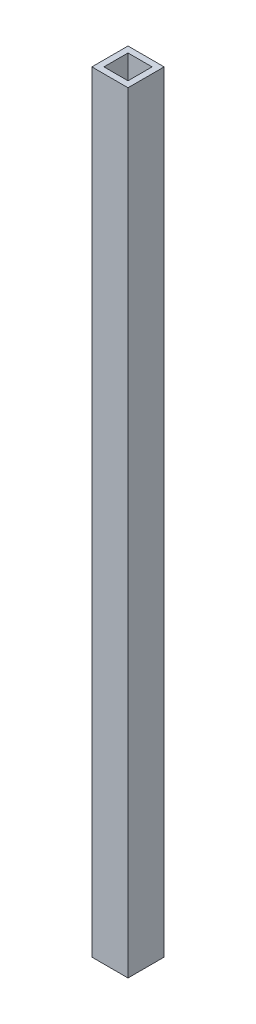
ISO-10303-21;
HEADER;
FILE_DESCRIPTION(('STEP AP214'),'2;1');
FILE_NAME('part.step','',(''),(''),'','','');
FILE_SCHEMA(('AUTOMOTIVE_DESIGN { 1 0 10303 214 1 1 1 1 }'));
ENDSEC;
DATA;
#1=APPLICATION_CONTEXT('core data for automotive mechanical design processes');
#2=APPLICATION_PROTOCOL_DEFINITION('international standard','automotive_design',2000,#1);
#3=PRODUCT_CONTEXT('',#1,'mechanical');
#4=PRODUCT('Part','Part','',(#3));
#5=PRODUCT_RELATED_PRODUCT_CATEGORY('part','',(#4));
#6=PRODUCT_DEFINITION_FORMATION('','',#4);
#7=PRODUCT_DEFINITION_CONTEXT('part definition',#1,'design');
#8=PRODUCT_DEFINITION('design','',#6,#7);
#9=PRODUCT_DEFINITION_SHAPE('','',#8);
#10=(LENGTH_UNIT() NAMED_UNIT(*) SI_UNIT(.MILLI.,.METRE.));
#11=(NAMED_UNIT(*) PLANE_ANGLE_UNIT() SI_UNIT($,.RADIAN.));
#12=(NAMED_UNIT(*) SI_UNIT($,.STERADIAN.) SOLID_ANGLE_UNIT());
#13=UNCERTAINTY_MEASURE_WITH_UNIT(LENGTH_MEASURE(1.E-05),#10,'distance_accuracy_value','');
#14=(GEOMETRIC_REPRESENTATION_CONTEXT(3) GLOBAL_UNCERTAINTY_ASSIGNED_CONTEXT((#13)) GLOBAL_UNIT_ASSIGNED_CONTEXT((#10,
#11,#12)) REPRESENTATION_CONTEXT('',''));
#15=CARTESIAN_POINT('',(0.,0.,0.));
#16=DIRECTION('',(0.,0.,1.));
#17=DIRECTION('',(1.,0.,0.));
#18=AXIS2_PLACEMENT_3D('',#15,#16,#17);
#19=CARTESIAN_POINT('',(0.,406.4,0.));
#20=DIRECTION('',(1.,0.,0.));
#21=DIRECTION('',(0.,0.,-1.));
#22=AXIS2_PLACEMENT_3D('',#19,#20,#21);
#23=PLANE('',#22);
#24=DIRECTION('',(0.,0.,1.));
#25=VECTOR('',#24,1.);
#26=CARTESIAN_POINT('',(0.,0.,0.));
#27=LINE('',#26,#25);
#28=CARTESIAN_POINT('',(0.,0.,-19.05));
#29=VERTEX_POINT('',#28);
#30=CARTESIAN_POINT('',(0.,0.,0.));
#31=VERTEX_POINT('',#30);
#32=EDGE_CURVE('E130',#29,#31,#27,.T.);
#33=ORIENTED_EDGE('',*,*,#32,.T.);
#34=DIRECTION('',(0.,-1.,0.));
#35=VECTOR('',#34,1.);
#36=CARTESIAN_POINT('',(0.,406.4,0.));
#37=LINE('',#36,#35);
#38=CARTESIAN_POINT('',(0.,406.4,0.));
#39=VERTEX_POINT('',#38);
#40=EDGE_CURVE('E11',#39,#31,#37,.T.);
#41=ORIENTED_EDGE('',*,*,#40,.F.);
#42=DIRECTION('',(0.,0.,1.));
#43=VECTOR('',#42,1.);
#44=CARTESIAN_POINT('',(0.,406.4,0.));
#45=LINE('',#44,#43);
#46=CARTESIAN_POINT('',(0.,406.4,-19.05));
#47=VERTEX_POINT('',#46);
#48=EDGE_CURVE('E134',#47,#39,#45,.T.);
#49=ORIENTED_EDGE('',*,*,#48,.F.);
#50=DIRECTION('',(0.,-1.,0.));
#51=VECTOR('',#50,1.);
#52=CARTESIAN_POINT('',(0.,406.4,-19.05));
#53=LINE('',#52,#51);
#54=EDGE_CURVE('E144',#47,#29,#53,.T.);
#55=ORIENTED_EDGE('',*,*,#54,.T.);
#56=EDGE_LOOP('',(#33,#41,#49,#55));
#57=FACE_BOUND('',#56,.T.);
#58=ADVANCED_FACE('F33',(#57),#23,.F.);
#59=CARTESIAN_POINT('',(0.,406.4,0.));
#60=DIRECTION('',(0.,0.,-1.));
#61=DIRECTION('',(-1.,0.,0.));
#62=AXIS2_PLACEMENT_3D('',#59,#60,#61);
#63=PLANE('',#62);
#64=DIRECTION('',(1.,0.,0.));
#65=VECTOR('',#64,1.);
#66=CARTESIAN_POINT('',(0.,0.,0.));
#67=LINE('',#66,#65);
#68=CARTESIAN_POINT('',(19.05,0.,0.));
#69=VERTEX_POINT('',#68);
#70=EDGE_CURVE('E147',#31,#69,#67,.T.);
#71=ORIENTED_EDGE('',*,*,#70,.T.);
#72=DIRECTION('',(0.,-1.,0.));
#73=VECTOR('',#72,1.);
#74=CARTESIAN_POINT('',(19.05,406.4,0.));
#75=LINE('',#74,#73);
#76=CARTESIAN_POINT('',(19.05,406.4,0.));
#77=VERTEX_POINT('',#76);
#78=EDGE_CURVE('E40',#77,#69,#75,.T.);
#79=ORIENTED_EDGE('',*,*,#78,.F.);
#80=DIRECTION('',(1.,0.,0.));
#81=VECTOR('',#80,1.);
#82=CARTESIAN_POINT('',(0.,406.4,0.));
#83=LINE('',#82,#81);
#84=EDGE_CURVE('E137',#39,#77,#83,.T.);
#85=ORIENTED_EDGE('',*,*,#84,.F.);
#86=ORIENTED_EDGE('',*,*,#40,.T.);
#87=EDGE_LOOP('',(#71,#79,#85,#86));
#88=FACE_BOUND('',#87,.T.);
#89=ADVANCED_FACE('F175',(#88),#63,.F.);
#90=CARTESIAN_POINT('',(19.05,406.4,0.));
#91=DIRECTION('',(-1.,0.,0.));
#92=DIRECTION('',(0.,0.,1.));
#93=AXIS2_PLACEMENT_3D('',#90,#91,#92);
#94=PLANE('',#93);
#95=DIRECTION('',(0.,0.,-1.));
#96=VECTOR('',#95,1.);
#97=CARTESIAN_POINT('',(19.05,0.,0.));
#98=LINE('',#97,#96);
#99=CARTESIAN_POINT('',(19.05,0.,-19.05));
#100=VERTEX_POINT('',#99);
#101=EDGE_CURVE('E149',#69,#100,#98,.T.);
#102=ORIENTED_EDGE('',*,*,#101,.T.);
#103=DIRECTION('',(0.,-1.,0.));
#104=VECTOR('',#103,1.);
#105=CARTESIAN_POINT('',(19.05,406.4,-19.05));
#106=LINE('',#105,#104);
#107=CARTESIAN_POINT('',(19.05,406.4,-19.05));
#108=VERTEX_POINT('',#107);
#109=EDGE_CURVE('E154',#108,#100,#106,.T.);
#110=ORIENTED_EDGE('',*,*,#109,.F.);
#111=DIRECTION('',(0.,0.,-1.));
#112=VECTOR('',#111,1.);
#113=CARTESIAN_POINT('',(19.05,406.4,0.));
#114=LINE('',#113,#112);
#115=EDGE_CURVE('E140',#77,#108,#114,.T.);
#116=ORIENTED_EDGE('',*,*,#115,.F.);
#117=ORIENTED_EDGE('',*,*,#78,.T.);
#118=EDGE_LOOP('',(#102,#110,#116,#117));
#119=FACE_BOUND('',#118,.T.);
#120=ADVANCED_FACE('F161',(#119),#94,.F.);
#121=CARTESIAN_POINT('',(0.,406.4,-19.05));
#122=DIRECTION('',(0.,0.,1.));
#123=DIRECTION('',(1.,0.,0.));
#124=AXIS2_PLACEMENT_3D('',#121,#122,#123);
#125=PLANE('',#124);
#126=DIRECTION('',(-1.,0.,0.));
#127=VECTOR('',#126,1.);
#128=CARTESIAN_POINT('',(0.,0.,-19.05));
#129=LINE('',#128,#127);
#130=EDGE_CURVE('E138',#100,#29,#129,.T.);
#131=ORIENTED_EDGE('',*,*,#130,.T.);
#132=ORIENTED_EDGE('',*,*,#54,.F.);
#133=DIRECTION('',(-1.,0.,0.));
#134=VECTOR('',#133,1.);
#135=CARTESIAN_POINT('',(0.,406.4,-19.05));
#136=LINE('',#135,#134);
#137=EDGE_CURVE('E142',#108,#47,#136,.T.);
#138=ORIENTED_EDGE('',*,*,#137,.F.);
#139=ORIENTED_EDGE('',*,*,#109,.T.);
#140=EDGE_LOOP('',(#131,#132,#138,#139));
#141=FACE_BOUND('',#140,.T.);
#142=ADVANCED_FACE('F168',(#141),#125,.F.);
#143=CARTESIAN_POINT('',(0.,406.4,0.));
#144=DIRECTION('',(0.,-1.,0.));
#145=DIRECTION('',(0.,0.,-1.));
#146=AXIS2_PLACEMENT_3D('',#143,#144,#145);
#147=PLANE('',#146);
#148=DIRECTION('',(1.,0.,0.));
#149=VECTOR('',#148,1.);
#150=CARTESIAN_POINT('',(3.175,406.4,-3.175));
#151=LINE('',#150,#149);
#152=CARTESIAN_POINT('',(3.175,406.4,-3.175));
#153=VERTEX_POINT('',#152);
#154=CARTESIAN_POINT('',(15.875,406.4,-3.175));
#155=VERTEX_POINT('',#154);
#156=EDGE_CURVE('E124',#153,#155,#151,.T.);
#157=ORIENTED_EDGE('',*,*,#156,.F.);
#158=DIRECTION('',(0.,0.,1.));
#159=VECTOR('',#158,1.);
#160=CARTESIAN_POINT('',(3.175,406.4,-15.875));
#161=LINE('',#160,#159);
#162=CARTESIAN_POINT('',(3.175,406.4,-15.875));
#163=VERTEX_POINT('',#162);
#164=EDGE_CURVE('E47',#163,#153,#161,.T.);
#165=ORIENTED_EDGE('',*,*,#164,.F.);
#166=DIRECTION('',(-1.,0.,0.));
#167=VECTOR('',#166,1.);
#168=CARTESIAN_POINT('',(3.175,406.4,-15.875));
#169=LINE('',#168,#167);
#170=CARTESIAN_POINT('',(15.875,406.4,-15.875));
#171=VERTEX_POINT('',#170);
#172=EDGE_CURVE('E115',#171,#163,#169,.T.);
#173=ORIENTED_EDGE('',*,*,#172,.F.);
#174=DIRECTION('',(0.,0.,-1.));
#175=VECTOR('',#174,1.);
#176=CARTESIAN_POINT('',(15.875,406.4,-15.875));
#177=LINE('',#176,#175);
#178=EDGE_CURVE('E118',#155,#171,#177,.T.);
#179=ORIENTED_EDGE('',*,*,#178,.F.);
#180=EDGE_LOOP('',(#157,#165,#173,#179));
#181=FACE_BOUND('',#180,.T.);
#182=ORIENTED_EDGE('',*,*,#48,.T.);
#183=ORIENTED_EDGE('',*,*,#84,.T.);
#184=ORIENTED_EDGE('',*,*,#115,.T.);
#185=ORIENTED_EDGE('',*,*,#137,.T.);
#186=EDGE_LOOP('',(#182,#183,#184,#185));
#187=FACE_BOUND('',#186,.T.);
#188=ADVANCED_FACE('F174',(#181,#187),#147,.F.);
#189=CARTESIAN_POINT('',(0.,0.,0.));
#190=DIRECTION('',(0.,-1.,0.));
#191=DIRECTION('',(0.,0.,-1.));
#192=AXIS2_PLACEMENT_3D('',#189,#190,#191);
#193=PLANE('',#192);
#194=DIRECTION('',(0.,0.,1.));
#195=VECTOR('',#194,1.);
#196=CARTESIAN_POINT('',(3.175,0.,-15.875));
#197=LINE('',#196,#195);
#198=CARTESIAN_POINT('',(3.175,0.,-15.875));
#199=VERTEX_POINT('',#198);
#200=CARTESIAN_POINT('',(3.175,0.,-3.175));
#201=VERTEX_POINT('',#200);
#202=EDGE_CURVE('E99',#199,#201,#197,.T.);
#203=ORIENTED_EDGE('',*,*,#202,.T.);
#204=DIRECTION('',(1.,0.,0.));
#205=VECTOR('',#204,1.);
#206=CARTESIAN_POINT('',(3.175,0.,-3.175));
#207=LINE('',#206,#205);
#208=CARTESIAN_POINT('',(15.875,0.,-3.175));
#209=VERTEX_POINT('',#208);
#210=EDGE_CURVE('E108',#201,#209,#207,.T.);
#211=ORIENTED_EDGE('',*,*,#210,.T.);
#212=DIRECTION('',(0.,0.,-1.));
#213=VECTOR('',#212,1.);
#214=CARTESIAN_POINT('',(15.875,0.,-15.875));
#215=LINE('',#214,#213);
#216=CARTESIAN_POINT('',(15.875,0.,-15.875));
#217=VERTEX_POINT('',#216);
#218=EDGE_CURVE('E55',#209,#217,#215,.T.);
#219=ORIENTED_EDGE('',*,*,#218,.T.);
#220=DIRECTION('',(-1.,0.,0.));
#221=VECTOR('',#220,1.);
#222=CARTESIAN_POINT('',(3.175,0.,-15.875));
#223=LINE('',#222,#221);
#224=EDGE_CURVE('E105',#217,#199,#223,.T.);
#225=ORIENTED_EDGE('',*,*,#224,.T.);
#226=EDGE_LOOP('',(#203,#211,#219,#225));
#227=FACE_BOUND('',#226,.T.);
#228=ORIENTED_EDGE('',*,*,#32,.F.);
#229=ORIENTED_EDGE('',*,*,#130,.F.);
#230=ORIENTED_EDGE('',*,*,#101,.F.);
#231=ORIENTED_EDGE('',*,*,#70,.F.);
#232=EDGE_LOOP('',(#228,#229,#230,#231));
#233=FACE_BOUND('',#232,.T.);
#234=ADVANCED_FACE('F112',(#227,#233),#193,.T.);
#235=CARTESIAN_POINT('',(3.175,0.,-15.875));
#236=DIRECTION('',(-1.,0.,0.));
#237=DIRECTION('',(0.,0.,1.));
#238=AXIS2_PLACEMENT_3D('',#235,#236,#237);
#239=PLANE('',#238);
#240=ORIENTED_EDGE('',*,*,#164,.T.);
#241=DIRECTION('',(0.,1.,0.));
#242=VECTOR('',#241,1.);
#243=CARTESIAN_POINT('',(3.175,0.,-3.175));
#244=LINE('',#243,#242);
#245=EDGE_CURVE('E95',#201,#153,#244,.T.);
#246=ORIENTED_EDGE('',*,*,#245,.F.);
#247=ORIENTED_EDGE('',*,*,#202,.F.);
#248=DIRECTION('',(0.,1.,0.));
#249=VECTOR('',#248,1.);
#250=CARTESIAN_POINT('',(3.175,0.,-15.875));
#251=LINE('',#250,#249);
#252=EDGE_CURVE('E128',#199,#163,#251,.T.);
#253=ORIENTED_EDGE('',*,*,#252,.T.);
#254=EDGE_LOOP('',(#240,#246,#247,#253));
#255=FACE_BOUND('',#254,.T.);
#256=ADVANCED_FACE('F97',(#255),#239,.F.);
#257=CARTESIAN_POINT('',(3.175,0.,-15.875));
#258=DIRECTION('',(0.,0.,-1.));
#259=DIRECTION('',(-1.,0.,0.));
#260=AXIS2_PLACEMENT_3D('',#257,#258,#259);
#261=PLANE('',#260);
#262=ORIENTED_EDGE('',*,*,#172,.T.);
#263=ORIENTED_EDGE('',*,*,#252,.F.);
#264=ORIENTED_EDGE('',*,*,#224,.F.);
#265=DIRECTION('',(0.,1.,0.));
#266=VECTOR('',#265,1.);
#267=CARTESIAN_POINT('',(15.875,0.,-15.875));
#268=LINE('',#267,#266);
#269=EDGE_CURVE('E131',#217,#171,#268,.T.);
#270=ORIENTED_EDGE('',*,*,#269,.T.);
#271=EDGE_LOOP('',(#262,#263,#264,#270));
#272=FACE_BOUND('',#271,.T.);
#273=ADVANCED_FACE('F192',(#272),#261,.F.);
#274=CARTESIAN_POINT('',(15.875,0.,-15.875));
#275=DIRECTION('',(1.,0.,0.));
#276=DIRECTION('',(0.,0.,-1.));
#277=AXIS2_PLACEMENT_3D('',#274,#275,#276);
#278=PLANE('',#277);
#279=ORIENTED_EDGE('',*,*,#178,.T.);
#280=ORIENTED_EDGE('',*,*,#269,.F.);
#281=ORIENTED_EDGE('',*,*,#218,.F.);
#282=DIRECTION('',(0.,1.,0.));
#283=VECTOR('',#282,1.);
#284=CARTESIAN_POINT('',(15.875,0.,-3.175));
#285=LINE('',#284,#283);
#286=EDGE_CURVE('E104',#209,#155,#285,.T.);
#287=ORIENTED_EDGE('',*,*,#286,.T.);
#288=EDGE_LOOP('',(#279,#280,#281,#287));
#289=FACE_BOUND('',#288,.T.);
#290=ADVANCED_FACE('F195',(#289),#278,.F.);
#291=CARTESIAN_POINT('',(3.175,0.,-3.175));
#292=DIRECTION('',(0.,0.,1.));
#293=DIRECTION('',(1.,0.,0.));
#294=AXIS2_PLACEMENT_3D('',#291,#292,#293);
#295=PLANE('',#294);
#296=ORIENTED_EDGE('',*,*,#156,.T.);
#297=ORIENTED_EDGE('',*,*,#286,.F.);
#298=ORIENTED_EDGE('',*,*,#210,.F.);
#299=ORIENTED_EDGE('',*,*,#245,.T.);
#300=EDGE_LOOP('',(#296,#297,#298,#299));
#301=FACE_BOUND('',#300,.T.);
#302=ADVANCED_FACE('F109',(#301),#295,.F.);
#303=CLOSED_SHELL('',(#58,#89,#120,#142,#188,#234,#256,#273,#290,#302));
#304=MANIFOLD_SOLID_BREP('B2',#303);
#305=ADVANCED_BREP_SHAPE_REPRESENTATION('',(#18,#304),#14);
#306=SHAPE_DEFINITION_REPRESENTATION(#9,#305);
ENDSEC;
END-ISO-10303-21;
